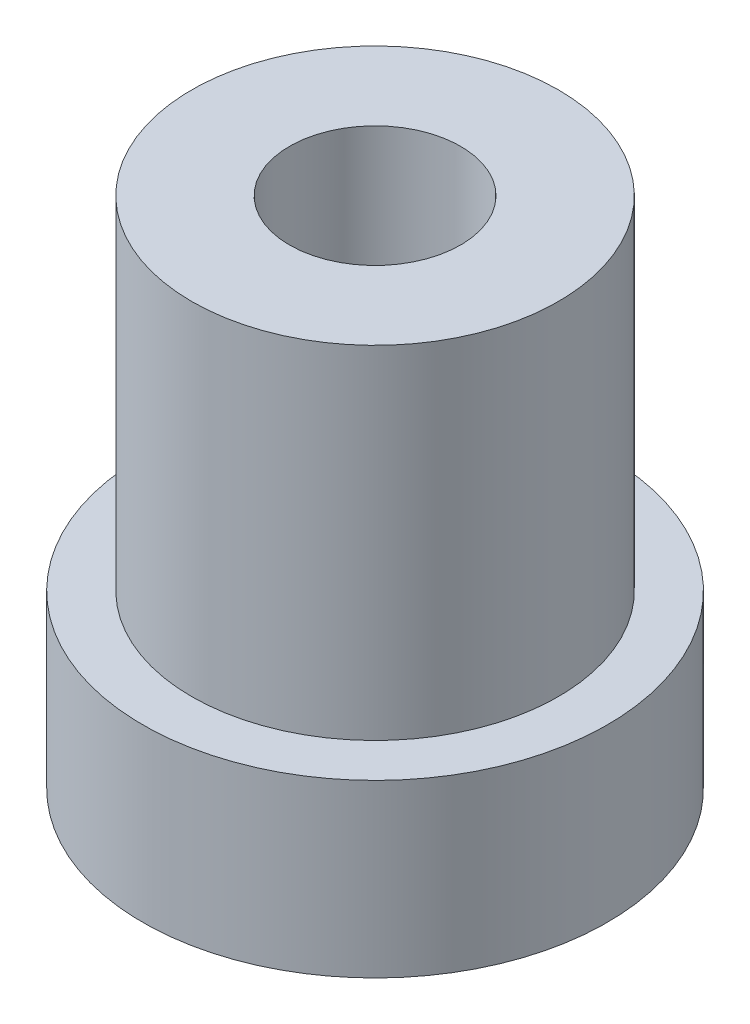
ISO-10303-21;
HEADER;
FILE_DESCRIPTION(('STEP AP214'),'2;1');
FILE_NAME('part.step','',(''),(''),'','','');
FILE_SCHEMA(('AUTOMOTIVE_DESIGN { 1 0 10303 214 1 1 1 1 }'));
ENDSEC;
DATA;
#1=APPLICATION_CONTEXT('core data for automotive mechanical design processes');
#2=APPLICATION_PROTOCOL_DEFINITION('international standard','automotive_design',2000,#1);
#3=PRODUCT_CONTEXT('',#1,'mechanical');
#4=PRODUCT('Part','Part','',(#3));
#5=PRODUCT_RELATED_PRODUCT_CATEGORY('part','',(#4));
#6=PRODUCT_DEFINITION_FORMATION('','',#4);
#7=PRODUCT_DEFINITION_CONTEXT('part definition',#1,'design');
#8=PRODUCT_DEFINITION('design','',#6,#7);
#9=PRODUCT_DEFINITION_SHAPE('','',#8);
#10=(LENGTH_UNIT() NAMED_UNIT(*) SI_UNIT(.MILLI.,.METRE.));
#11=(NAMED_UNIT(*) PLANE_ANGLE_UNIT() SI_UNIT($,.RADIAN.));
#12=(NAMED_UNIT(*) SI_UNIT($,.STERADIAN.) SOLID_ANGLE_UNIT());
#13=UNCERTAINTY_MEASURE_WITH_UNIT(LENGTH_MEASURE(1.E-05),#10,'distance_accuracy_value','');
#14=(GEOMETRIC_REPRESENTATION_CONTEXT(3) GLOBAL_UNCERTAINTY_ASSIGNED_CONTEXT((#13)) GLOBAL_UNIT_ASSIGNED_CONTEXT((#10,
#11,#12)) REPRESENTATION_CONTEXT('',''));
#15=CARTESIAN_POINT('',(0.,0.,0.));
#16=DIRECTION('',(0.,0.,1.));
#17=DIRECTION('',(1.,0.,0.));
#18=AXIS2_PLACEMENT_3D('',#15,#16,#17);
#19=CARTESIAN_POINT('',(0.,10.5,0.));
#20=DIRECTION('',(0.,-1.,0.));
#21=DIRECTION('',(0.,0.,-1.));
#22=AXIS2_PLACEMENT_3D('',#19,#20,#21);
#23=CYLINDRICAL_SURFACE('',#22,3.75);
#24=CARTESIAN_POINT('',(0.,10.5,0.));
#25=DIRECTION('',(0.,1.,0.));
#26=DIRECTION('',(0.,0.,1.));
#27=AXIS2_PLACEMENT_3D('',#24,#25,#26);
#28=CIRCLE('',#27,3.75);
#29=CARTESIAN_POINT('',(0.,10.5,-3.75));
#30=VERTEX_POINT('',#29);
#31=EDGE_CURVE('E46',#30,#30,#28,.T.);
#32=CARTESIAN_POINT('',(0.,3.5,0.));
#33=DIRECTION('',(0.,-1.,0.));
#34=DIRECTION('',(0.,0.,-1.));
#35=AXIS2_PLACEMENT_3D('',#32,#33,#34);
#36=CIRCLE('',#35,3.75);
#37=CARTESIAN_POINT('',(0.,3.5,-3.75));
#38=VERTEX_POINT('',#37);
#39=EDGE_CURVE('E10',#38,#38,#36,.T.);
#40=CARTESIAN_POINT('',(0.,10.5,-3.75));
#41=CARTESIAN_POINT('',(0.,10.4270833333333,-3.75));
#42=CARTESIAN_POINT('',(0.,10.3541666666667,-3.75));
#43=CARTESIAN_POINT('',(0.,10.2083333333333,-3.75));
#44=CARTESIAN_POINT('',(0.,10.1354166666667,-3.75));
#45=CARTESIAN_POINT('',(0.,9.98958333333333,-3.75));
#46=CARTESIAN_POINT('',(0.,9.91666666666667,-3.75));
#47=CARTESIAN_POINT('',(0.,9.77083333333333,-3.75));
#48=CARTESIAN_POINT('',(0.,9.69791666666667,-3.75));
#49=CARTESIAN_POINT('',(0.,9.55208333333333,-3.75));
#50=CARTESIAN_POINT('',(0.,9.47916666666667,-3.75));
#51=CARTESIAN_POINT('',(0.,9.33333333333333,-3.75));
#52=CARTESIAN_POINT('',(0.,9.26041666666667,-3.75));
#53=CARTESIAN_POINT('',(0.,9.11458333333333,-3.75));
#54=CARTESIAN_POINT('',(0.,9.04166666666667,-3.75));
#55=CARTESIAN_POINT('',(0.,8.89583333333333,-3.75));
#56=CARTESIAN_POINT('',(0.,8.82291666666667,-3.75));
#57=CARTESIAN_POINT('',(0.,8.67708333333333,-3.75));
#58=CARTESIAN_POINT('',(0.,8.60416666666667,-3.75));
#59=CARTESIAN_POINT('',(0.,8.45833333333333,-3.75));
#60=CARTESIAN_POINT('',(0.,8.38541666666667,-3.75));
#61=CARTESIAN_POINT('',(0.,8.23958333333333,-3.75));
#62=CARTESIAN_POINT('',(0.,8.16666666666667,-3.75));
#63=CARTESIAN_POINT('',(0.,8.02083333333333,-3.75));
#64=CARTESIAN_POINT('',(0.,7.94791666666667,-3.75));
#65=CARTESIAN_POINT('',(0.,7.80208333333333,-3.75));
#66=CARTESIAN_POINT('',(0.,7.72916666666667,-3.75));
#67=CARTESIAN_POINT('',(0.,7.58333333333333,-3.75));
#68=CARTESIAN_POINT('',(0.,7.51041666666667,-3.75));
#69=CARTESIAN_POINT('',(0.,7.36458333333333,-3.75));
#70=CARTESIAN_POINT('',(0.,7.29166666666667,-3.75));
#71=CARTESIAN_POINT('',(0.,7.14583333333333,-3.75));
#72=CARTESIAN_POINT('',(0.,7.07291666666667,-3.75));
#73=CARTESIAN_POINT('',(0.,6.92708333333333,-3.75));
#74=CARTESIAN_POINT('',(0.,6.85416666666667,-3.75));
#75=CARTESIAN_POINT('',(0.,6.70833333333333,-3.75));
#76=CARTESIAN_POINT('',(0.,6.63541666666667,-3.75));
#77=CARTESIAN_POINT('',(0.,6.48958333333333,-3.75));
#78=CARTESIAN_POINT('',(0.,6.41666666666667,-3.75));
#79=CARTESIAN_POINT('',(0.,6.27083333333333,-3.75));
#80=CARTESIAN_POINT('',(0.,6.19791666666667,-3.75));
#81=CARTESIAN_POINT('',(0.,6.05208333333333,-3.75));
#82=CARTESIAN_POINT('',(0.,5.97916666666667,-3.75));
#83=CARTESIAN_POINT('',(0.,5.83333333333333,-3.75));
#84=CARTESIAN_POINT('',(0.,5.76041666666667,-3.75));
#85=CARTESIAN_POINT('',(0.,5.61458333333333,-3.75));
#86=CARTESIAN_POINT('',(0.,5.54166666666667,-3.75));
#87=CARTESIAN_POINT('',(0.,5.39583333333333,-3.75));
#88=CARTESIAN_POINT('',(0.,5.32291666666667,-3.75));
#89=CARTESIAN_POINT('',(0.,5.17708333333333,-3.75));
#90=CARTESIAN_POINT('',(0.,5.10416666666667,-3.75));
#91=CARTESIAN_POINT('',(0.,4.95833333333333,-3.75));
#92=CARTESIAN_POINT('',(0.,4.88541666666667,-3.75));
#93=CARTESIAN_POINT('',(0.,4.73958333333333,-3.75));
#94=CARTESIAN_POINT('',(0.,4.66666666666667,-3.75));
#95=CARTESIAN_POINT('',(0.,4.52083333333333,-3.75));
#96=CARTESIAN_POINT('',(0.,4.44791666666667,-3.75));
#97=CARTESIAN_POINT('',(0.,4.30208333333333,-3.75));
#98=CARTESIAN_POINT('',(0.,4.22916666666667,-3.75));
#99=CARTESIAN_POINT('',(0.,4.08333333333333,-3.75));
#100=CARTESIAN_POINT('',(0.,4.01041666666667,-3.75));
#101=CARTESIAN_POINT('',(0.,3.86458333333333,-3.75));
#102=CARTESIAN_POINT('',(0.,3.79166666666667,-3.75));
#103=CARTESIAN_POINT('',(0.,3.64583333333333,-3.75));
#104=CARTESIAN_POINT('',(0.,3.57291666666667,-3.75));
#105=CARTESIAN_POINT('',(0.,3.5,-3.75));
#106=B_SPLINE_CURVE_WITH_KNOTS('',3,(#40,#41,#42,#43,#44,#45,#46,#47,#48,#49,#50,#51,#52,#53,
#54,#55,#56,#57,#58,#59,#60,#61,#62,#63,#64,#65,#66,#67,#68,#69,#70,#71,#72,#73,#74,#75,#76,#77,
#78,#79,#80,#81,#82,#83,#84,#85,#86,#87,#88,#89,#90,#91,#92,#93,#94,#95,#96,#97,#98,#99,#100,
#101,#102,#103,#104,#105),.UNSPECIFIED.,.F.,.F.,(4,2,2,2,2,2,2,2,2,2,2,2,2,2,2,2,2,2,2,2,2,2,2,
2,2,2,2,2,2,2,2,2,4),(0.,0.218749999999998,0.437499999999999,0.656249999999999,
0.874999999999999,1.09375,1.3125,1.53125,1.75,1.96875,2.1875,2.40625,2.625,2.84375,3.0625,
3.28125,3.5,3.71875,3.9375,4.15625,4.375,4.59375,4.8125,5.03125,5.25,5.46875,5.6875,5.90625,
6.125,6.34375,6.5625,6.78125,7.),.UNSPECIFIED.);
#107=EDGE_CURVE('BSEAM35',#30,#38,#106,.T.);
#108=ORIENTED_EDGE('',*,*,#31,.F.);
#109=ORIENTED_EDGE('',*,*,#39,.F.);
#110=ORIENTED_EDGE('',*,*,#107,.T.);
#111=ORIENTED_EDGE('',*,*,#107,.F.);
#112=EDGE_LOOP('',(#108,#110,#109,#111));
#113=FACE_BOUND('',#112,.T.);
#114=ADVANCED_FACE('F35',(#113),#23,.T.);
#115=CARTESIAN_POINT('',(0.,10.5,0.));
#116=DIRECTION('',(0.,1.,0.));
#117=DIRECTION('',(0.,0.,1.));
#118=AXIS2_PLACEMENT_3D('',#115,#116,#117);
#119=CYLINDRICAL_SURFACE('',#118,1.75);
#120=CARTESIAN_POINT('',(0.,10.5,0.));
#121=DIRECTION('',(0.,1.,0.));
#122=DIRECTION('',(0.,0.,1.));
#123=AXIS2_PLACEMENT_3D('',#120,#121,#122);
#124=CIRCLE('',#123,1.75);
#125=CARTESIAN_POINT('',(0.,10.5,1.75));
#126=VERTEX_POINT('',#125);
#127=EDGE_CURVE('E51',#126,#126,#124,.T.);
#128=ORIENTED_EDGE('',*,*,#127,.T.);
#129=EDGE_LOOP('',(#128));
#130=FACE_BOUND('',#129,.T.);
#131=CARTESIAN_POINT('',(0.,3.5,0.));
#132=DIRECTION('',(0.,-1.,0.));
#133=DIRECTION('',(0.,0.,-1.));
#134=AXIS2_PLACEMENT_3D('',#131,#132,#133);
#135=CIRCLE('',#134,1.75);
#136=CARTESIAN_POINT('',(0.,3.5,-1.75));
#137=VERTEX_POINT('',#136);
#138=EDGE_CURVE('E38',#137,#137,#135,.F.);
#139=ORIENTED_EDGE('',*,*,#138,.F.);
#140=EDGE_LOOP('',(#139));
#141=FACE_BOUND('',#140,.T.);
#142=ADVANCED_FACE('F61',(#130,#141),#119,.F.);
#143=CARTESIAN_POINT('',(0.,10.5,0.));
#144=DIRECTION('',(0.,1.,0.));
#145=DIRECTION('',(0.,0.,1.));
#146=AXIS2_PLACEMENT_3D('',#143,#144,#145);
#147=PLANE('',#146);
#148=ORIENTED_EDGE('',*,*,#127,.F.);
#149=EDGE_LOOP('',(#148));
#150=FACE_BOUND('',#149,.T.);
#151=ORIENTED_EDGE('',*,*,#31,.T.);
#152=EDGE_LOOP('',(#151));
#153=FACE_BOUND('',#152,.T.);
#154=ADVANCED_FACE('F57',(#150,#153),#147,.T.);
#155=CARTESIAN_POINT('',(0.,3.5,0.));
#156=DIRECTION('',(0.,-1.,0.));
#157=DIRECTION('',(0.,0.,-1.));
#158=AXIS2_PLACEMENT_3D('',#155,#156,#157);
#159=PLANE('',#158);
#160=ORIENTED_EDGE('',*,*,#138,.T.);
#161=EDGE_LOOP('',(#160));
#162=FACE_BOUND('',#161,.T.);
#163=ADVANCED_FACE('F70',(#162),#159,.F.);
#164=CARTESIAN_POINT('',(0.,3.5,0.));
#165=DIRECTION('',(0.,-1.,0.));
#166=DIRECTION('',(0.,0.,-1.));
#167=AXIS2_PLACEMENT_3D('',#164,#165,#166);
#168=CIRCLE('',#167,4.75);
#169=CARTESIAN_POINT('',(0.,3.5,-4.75));
#170=VERTEX_POINT('',#169);
#171=EDGE_CURVE('E53',#170,#170,#168,.T.);
#172=ORIENTED_EDGE('',*,*,#171,.F.);
#173=EDGE_LOOP('',(#172));
#174=FACE_BOUND('',#173,.T.);
#175=ORIENTED_EDGE('',*,*,#39,.T.);
#176=EDGE_LOOP('',(#175));
#177=FACE_BOUND('',#176,.T.);
#178=ADVANCED_FACE('F83',(#174,#177),#159,.F.);
#179=CARTESIAN_POINT('',(0.,3.5,0.));
#180=DIRECTION('',(0.,-1.,0.));
#181=DIRECTION('',(0.,0.,-1.));
#182=AXIS2_PLACEMENT_3D('',#179,#180,#181);
#183=CYLINDRICAL_SURFACE('',#182,4.75);
#184=ORIENTED_EDGE('',*,*,#171,.T.);
#185=EDGE_LOOP('',(#184));
#186=FACE_BOUND('',#185,.T.);
#187=CARTESIAN_POINT('',(0.,0.,0.));
#188=DIRECTION('',(0.,-1.,0.));
#189=DIRECTION('',(0.,0.,-1.));
#190=AXIS2_PLACEMENT_3D('',#187,#188,#189);
#191=CIRCLE('',#190,4.75);
#192=CARTESIAN_POINT('',(0.,0.,-4.75));
#193=VERTEX_POINT('',#192);
#194=EDGE_CURVE('E49',#193,#193,#191,.T.);
#195=ORIENTED_EDGE('',*,*,#194,.F.);
#196=EDGE_LOOP('',(#195));
#197=FACE_BOUND('',#196,.T.);
#198=ADVANCED_FACE('F75',(#186,#197),#183,.T.);
#199=CARTESIAN_POINT('',(0.,0.,0.));
#200=DIRECTION('',(0.,1.,0.));
#201=DIRECTION('',(0.,0.,1.));
#202=AXIS2_PLACEMENT_3D('',#199,#200,#201);
#203=PLANE('',#202);
#204=ORIENTED_EDGE('',*,*,#194,.T.);
#205=EDGE_LOOP('',(#204));
#206=FACE_BOUND('',#205,.T.);
#207=ADVANCED_FACE('F77',(#206),#203,.F.);
#208=CLOSED_SHELL('',(#114,#142,#154,#163,#178,#198,#207));
#209=MANIFOLD_SOLID_BREP('B2',#208);
#210=ADVANCED_BREP_SHAPE_REPRESENTATION('',(#18,#209),#14);
#211=SHAPE_DEFINITION_REPRESENTATION(#9,#210);
ENDSEC;
END-ISO-10303-21;
